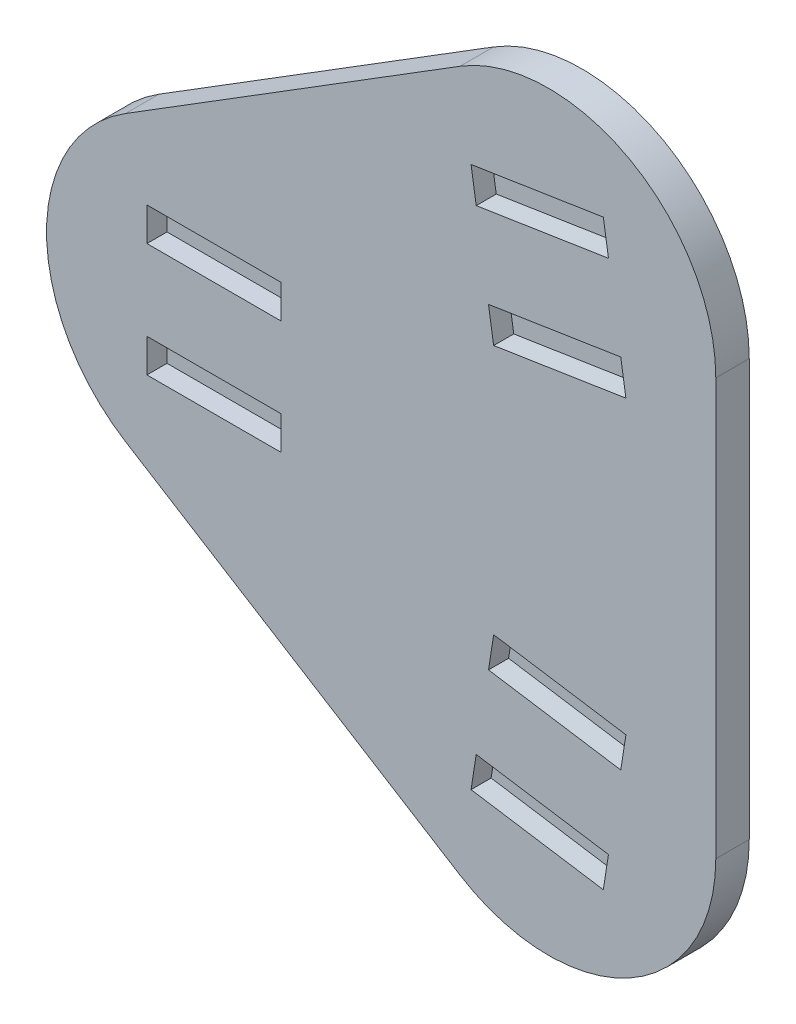
ISO-10303-21;
HEADER;
FILE_DESCRIPTION(('STEP AP214'),'2;1');
FILE_NAME('part.step','',(''),(''),'','','');
FILE_SCHEMA(('AUTOMOTIVE_DESIGN { 1 0 10303 214 1 1 1 1 }'));
ENDSEC;
DATA;
#1=APPLICATION_CONTEXT('core data for automotive mechanical design processes');
#2=APPLICATION_PROTOCOL_DEFINITION('international standard','automotive_design',2000,#1);
#3=PRODUCT_CONTEXT('',#1,'mechanical');
#4=PRODUCT('Part','Part','',(#3));
#5=PRODUCT_RELATED_PRODUCT_CATEGORY('part','',(#4));
#6=PRODUCT_DEFINITION_FORMATION('','',#4);
#7=PRODUCT_DEFINITION_CONTEXT('part definition',#1,'design');
#8=PRODUCT_DEFINITION('design','',#6,#7);
#9=PRODUCT_DEFINITION_SHAPE('','',#8);
#10=(LENGTH_UNIT() NAMED_UNIT(*) SI_UNIT(.MILLI.,.METRE.));
#11=(NAMED_UNIT(*) PLANE_ANGLE_UNIT() SI_UNIT($,.RADIAN.));
#12=(NAMED_UNIT(*) SI_UNIT($,.STERADIAN.) SOLID_ANGLE_UNIT());
#13=UNCERTAINTY_MEASURE_WITH_UNIT(LENGTH_MEASURE(1.E-05),#10,'distance_accuracy_value','');
#14=(GEOMETRIC_REPRESENTATION_CONTEXT(3) GLOBAL_UNCERTAINTY_ASSIGNED_CONTEXT((#13)) GLOBAL_UNIT_ASSIGNED_CONTEXT((#10,
#11,#12)) REPRESENTATION_CONTEXT('',''));
#15=CARTESIAN_POINT('',(0.,0.,0.));
#16=DIRECTION('',(0.,0.,1.));
#17=DIRECTION('',(1.,0.,0.));
#18=AXIS2_PLACEMENT_3D('',#15,#16,#17);
#19=CARTESIAN_POINT('',(0.,0.,3.));
#20=DIRECTION('',(0.,0.,1.));
#21=DIRECTION('',(1.,0.,0.));
#22=AXIS2_PLACEMENT_3D('',#19,#20,#21);
#23=PLANE('',#22);
#24=DIRECTION('',(-0.153498232012829,0.9881489223639,0.));
#25=VECTOR('',#24,1.);
#26=CARTESIAN_POINT('',(25.9604998315621,38.5786902593117,3.));
#27=LINE('',#26,#25);
#28=CARTESIAN_POINT('',(25.9604998315621,38.5786902593117,3.));
#29=VERTEX_POINT('',#28);
#30=CARTESIAN_POINT('',(25.1930086714979,43.5194348711312,3.));
#31=VERTEX_POINT('',#30);
#32=EDGE_CURVE('E288',#29,#31,#27,.T.);
#33=ORIENTED_EDGE('',*,*,#32,.F.);
#34=DIRECTION('',(0.9881489223639,0.153498232012826,0.));
#35=VECTOR('',#34,1.);
#36=CARTESIAN_POINT('',(6.19752138428396,35.5087256190551,3.));
#37=LINE('',#36,#35);
#38=CARTESIAN_POINT('',(6.19752138428396,35.5087256190551,3.));
#39=VERTEX_POINT('',#38);
#40=EDGE_CURVE('E285',#39,#29,#37,.T.);
#41=ORIENTED_EDGE('',*,*,#40,.F.);
#42=DIRECTION('',(0.153498232012828,-0.988148922363899,0.));
#43=VECTOR('',#42,1.);
#44=CARTESIAN_POINT('',(5.43003022421982,40.4494702308747,3.));
#45=LINE('',#44,#43);
#46=CARTESIAN_POINT('',(5.43003022421982,40.4494702308747,3.));
#47=VERTEX_POINT('',#46);
#48=EDGE_CURVE('E296',#47,#39,#45,.T.);
#49=ORIENTED_EDGE('',*,*,#48,.F.);
#50=DIRECTION('',(-0.9881489223639,-0.153498232012825,0.));
#51=VECTOR('',#50,1.);
#52=CARTESIAN_POINT('',(25.1930086714979,43.5194348711312,3.));
#53=LINE('',#52,#51);
#54=EDGE_CURVE('E292',#31,#47,#53,.T.);
#55=ORIENTED_EDGE('',*,*,#54,.F.);
#56=EDGE_LOOP('',(#33,#41,#49,#55));
#57=FACE_BOUND('',#56,.T.);
#58=DIRECTION('',(0.153498232012826,-0.9881489223639,0.));
#59=VECTOR('',#58,1.);
#60=CARTESIAN_POINT('',(8.03950016843787,23.6509385506883,3.));
#61=LINE('',#60,#59);
#62=CARTESIAN_POINT('',(8.03950016843787,23.6509385506883,3.));
#63=VERTEX_POINT('',#62);
#64=CARTESIAN_POINT('',(8.806991328502,18.7101939388688,3.));
#65=VERTEX_POINT('',#64);
#66=EDGE_CURVE('E330',#63,#65,#61,.T.);
#67=ORIENTED_EDGE('',*,*,#66,.F.);
#68=DIRECTION('',(-0.9881489223639,-0.153498232012827,0.));
#69=VECTOR('',#68,1.);
#70=CARTESIAN_POINT('',(27.802478615716,26.7209031909449,3.));
#71=LINE('',#70,#69);
#72=CARTESIAN_POINT('',(27.802478615716,26.7209031909449,3.));
#73=VERTEX_POINT('',#72);
#74=EDGE_CURVE('E327',#73,#63,#71,.T.);
#75=ORIENTED_EDGE('',*,*,#74,.F.);
#76=DIRECTION('',(-0.153498232012826,0.9881489223639,0.));
#77=VECTOR('',#76,1.);
#78=CARTESIAN_POINT('',(28.5699697757801,21.7801585791254,3.));
#79=LINE('',#78,#77);
#80=CARTESIAN_POINT('',(28.5699697757801,21.7801585791254,3.));
#81=VERTEX_POINT('',#80);
#82=EDGE_CURVE('E338',#81,#73,#79,.T.);
#83=ORIENTED_EDGE('',*,*,#82,.F.);
#84=DIRECTION('',(0.9881489223639,0.153498232012826,0.));
#85=VECTOR('',#84,1.);
#86=CARTESIAN_POINT('',(8.806991328502,18.7101939388688,3.));
#87=LINE('',#86,#85);
#88=EDGE_CURVE('E334',#65,#81,#87,.T.);
#89=ORIENTED_EDGE('',*,*,#88,.F.);
#90=EDGE_LOOP('',(#67,#75,#83,#89));
#91=FACE_BOUND('',#90,.T.);
#92=DIRECTION('',(0.,1.,0.));
#93=VECTOR('',#92,1.);
#94=CARTESIAN_POINT('',(-23.,6.,3.));
#95=LINE('',#94,#93);
#96=CARTESIAN_POINT('',(-23.,6.,3.));
#97=VERTEX_POINT('',#96);
#98=CARTESIAN_POINT('',(-23.,11.,3.));
#99=VERTEX_POINT('',#98);
#100=EDGE_CURVE('E372',#97,#99,#95,.T.);
#101=ORIENTED_EDGE('',*,*,#100,.F.);
#102=DIRECTION('',(1.,0.,0.));
#103=VECTOR('',#102,1.);
#104=CARTESIAN_POINT('',(-43.,6.,3.));
#105=LINE('',#104,#103);
#106=CARTESIAN_POINT('',(-43.,6.,3.));
#107=VERTEX_POINT('',#106);
#108=EDGE_CURVE('E369',#107,#97,#105,.T.);
#109=ORIENTED_EDGE('',*,*,#108,.F.);
#110=DIRECTION('',(0.,-1.,0.));
#111=VECTOR('',#110,1.);
#112=CARTESIAN_POINT('',(-43.,11.,3.));
#113=LINE('',#112,#111);
#114=CARTESIAN_POINT('',(-43.,11.,3.));
#115=VERTEX_POINT('',#114);
#116=EDGE_CURVE('E380',#115,#107,#113,.T.);
#117=ORIENTED_EDGE('',*,*,#116,.F.);
#118=DIRECTION('',(-1.,0.,0.));
#119=VECTOR('',#118,1.);
#120=CARTESIAN_POINT('',(-43.,11.,3.));
#121=LINE('',#120,#119);
#122=EDGE_CURVE('E376',#99,#115,#121,.T.);
#123=ORIENTED_EDGE('',*,*,#122,.F.);
#124=EDGE_LOOP('',(#101,#109,#117,#123));
#125=FACE_BOUND('',#124,.T.);
#126=DIRECTION('',(0.,1.,0.));
#127=VECTOR('',#126,1.);
#128=CARTESIAN_POINT('',(-23.,-11.,3.));
#129=LINE('',#128,#127);
#130=CARTESIAN_POINT('',(-23.,-11.,3.));
#131=VERTEX_POINT('',#130);
#132=CARTESIAN_POINT('',(-23.,-6.00000000000001,3.));
#133=VERTEX_POINT('',#132);
#134=EDGE_CURVE('E414',#131,#133,#129,.T.);
#135=ORIENTED_EDGE('',*,*,#134,.F.);
#136=DIRECTION('',(1.,0.,0.));
#137=VECTOR('',#136,1.);
#138=CARTESIAN_POINT('',(-43.,-11.,3.));
#139=LINE('',#138,#137);
#140=CARTESIAN_POINT('',(-43.,-11.,3.));
#141=VERTEX_POINT('',#140);
#142=EDGE_CURVE('E411',#141,#131,#139,.T.);
#143=ORIENTED_EDGE('',*,*,#142,.F.);
#144=DIRECTION('',(0.,-1.,0.));
#145=VECTOR('',#144,1.);
#146=CARTESIAN_POINT('',(-43.,-6.00000000000001,3.));
#147=LINE('',#146,#145);
#148=CARTESIAN_POINT('',(-43.,-6.00000000000001,3.));
#149=VERTEX_POINT('',#148);
#150=EDGE_CURVE('E422',#149,#141,#147,.T.);
#151=ORIENTED_EDGE('',*,*,#150,.F.);
#152=DIRECTION('',(-1.,0.,0.));
#153=VECTOR('',#152,1.);
#154=CARTESIAN_POINT('',(-43.,-6.00000000000001,3.));
#155=LINE('',#154,#153);
#156=EDGE_CURVE('E418',#133,#149,#155,.T.);
#157=ORIENTED_EDGE('',*,*,#156,.F.);
#158=EDGE_LOOP('',(#135,#143,#151,#157));
#159=FACE_BOUND('',#158,.T.);
#160=DIRECTION('',(-0.153498232012826,-0.9881489223639,0.));
#161=VECTOR('',#160,1.);
#162=CARTESIAN_POINT('',(8.80699132850207,-18.7101939388688,3.));
#163=LINE('',#162,#161);
#164=CARTESIAN_POINT('',(8.80699132850207,-18.7101939388688,3.));
#165=VERTEX_POINT('',#164);
#166=CARTESIAN_POINT('',(8.03950016843794,-23.6509385506883,3.));
#167=VERTEX_POINT('',#166);
#168=EDGE_CURVE('E456',#165,#167,#163,.T.);
#169=ORIENTED_EDGE('',*,*,#168,.F.);
#170=DIRECTION('',(-0.9881489223639,0.153498232012826,0.));
#171=VECTOR('',#170,1.);
#172=CARTESIAN_POINT('',(28.5699697757801,-21.7801585791254,3.));
#173=LINE('',#172,#171);
#174=CARTESIAN_POINT('',(28.5699697757801,-21.7801585791254,3.));
#175=VERTEX_POINT('',#174);
#176=EDGE_CURVE('E453',#175,#165,#173,.T.);
#177=ORIENTED_EDGE('',*,*,#176,.F.);
#178=DIRECTION('',(0.153498232012826,0.9881489223639,0.));
#179=VECTOR('',#178,1.);
#180=CARTESIAN_POINT('',(27.8024786157159,-26.7209031909449,3.));
#181=LINE('',#180,#179);
#182=CARTESIAN_POINT('',(27.8024786157159,-26.7209031909449,3.));
#183=VERTEX_POINT('',#182);
#184=EDGE_CURVE('E464',#183,#175,#181,.T.);
#185=ORIENTED_EDGE('',*,*,#184,.F.);
#186=DIRECTION('',(0.9881489223639,-0.153498232012826,0.));
#187=VECTOR('',#186,1.);
#188=CARTESIAN_POINT('',(8.03950016843794,-23.6509385506883,3.));
#189=LINE('',#188,#187);
#190=EDGE_CURVE('E460',#167,#183,#189,.T.);
#191=ORIENTED_EDGE('',*,*,#190,.F.);
#192=EDGE_LOOP('',(#169,#177,#185,#191));
#193=FACE_BOUND('',#192,.T.);
#194=DIRECTION('',(0.9881489223639,-0.153498232012826,0.));
#195=VECTOR('',#194,1.);
#196=CARTESIAN_POINT('',(5.43003022421989,-40.4494702308747,3.));
#197=LINE('',#196,#195);
#198=CARTESIAN_POINT('',(5.43003022421989,-40.4494702308747,3.));
#199=VERTEX_POINT('',#198);
#200=CARTESIAN_POINT('',(25.1930086714979,-43.5194348711312,3.));
#201=VERTEX_POINT('',#200);
#202=EDGE_CURVE('E503',#199,#201,#197,.T.);
#203=ORIENTED_EDGE('',*,*,#202,.F.);
#204=DIRECTION('',(-0.153498232012827,-0.9881489223639,0.));
#205=VECTOR('',#204,1.);
#206=CARTESIAN_POINT('',(6.19752138428403,-35.5087256190551,3.));
#207=LINE('',#206,#205);
#208=CARTESIAN_POINT('',(6.19752138428403,-35.5087256190551,3.));
#209=VERTEX_POINT('',#208);
#210=EDGE_CURVE('E499',#209,#199,#207,.T.);
#211=ORIENTED_EDGE('',*,*,#210,.F.);
#212=DIRECTION('',(-0.9881489223639,0.153498232012826,0.));
#213=VECTOR('',#212,1.);
#214=CARTESIAN_POINT('',(16.079010607923,-37.0437079391834,3.));
#215=LINE('',#214,#213);
#216=CARTESIAN_POINT('',(25.960499831562,-38.5786902593117,3.));
#217=VERTEX_POINT('',#216);
#218=EDGE_CURVE('E496',#217,#209,#215,.T.);
#219=ORIENTED_EDGE('',*,*,#218,.F.);
#220=DIRECTION('',(0.153498232012827,0.9881489223639,0.));
#221=VECTOR('',#220,1.);
#222=CARTESIAN_POINT('',(25.1930086714979,-43.5194348711312,3.));
#223=LINE('',#222,#221);
#224=EDGE_CURVE('E506',#201,#217,#223,.T.);
#225=ORIENTED_EDGE('',*,*,#224,.F.);
#226=EDGE_LOOP('',(#203,#211,#219,#225));
#227=FACE_BOUND('',#226,.T.);
#228=DIRECTION('',(0.849028395414197,-0.528347218957754,0.));
#229=VECTOR('',#228,1.);
#230=CARTESIAN_POINT('',(-46.2086804739439,-21.2257098853549,3.));
#231=LINE('',#230,#229);
#232=CARTESIAN_POINT('',(-46.2086804739439,-21.2257098853549,3.));
#233=VERTEX_POINT('',#232);
#234=CARTESIAN_POINT('',(3.79131952605611,-52.340524290355,3.));
#235=VERTEX_POINT('',#234);
#236=EDGE_CURVE('E269',#233,#235,#231,.T.);
#237=ORIENTED_EDGE('',*,*,#236,.T.);
#238=CARTESIAN_POINT('',(17.,-31.114814405,3.));
#239=DIRECTION('',(0.,0.,1.));
#240=DIRECTION('',(1.,0.,0.));
#241=AXIS2_PLACEMENT_3D('',#238,#239,#240);
#242=CIRCLE('',#241,25.);
#243=CARTESIAN_POINT('',(42.,-31.114814405,3.));
#244=VERTEX_POINT('',#243);
#245=EDGE_CURVE('E263',#235,#244,#242,.T.);
#246=ORIENTED_EDGE('',*,*,#245,.T.);
#247=DIRECTION('',(0.,1.,0.));
#248=VECTOR('',#247,1.);
#249=CARTESIAN_POINT('',(42.,-31.114814405,3.));
#250=LINE('',#249,#248);
#251=CARTESIAN_POINT('',(42.,31.114814405,3.));
#252=VERTEX_POINT('',#251);
#253=EDGE_CURVE('E259',#244,#252,#250,.T.);
#254=ORIENTED_EDGE('',*,*,#253,.T.);
#255=CARTESIAN_POINT('',(17.,31.114814405,3.));
#256=DIRECTION('',(0.,0.,1.));
#257=DIRECTION('',(1.,0.,0.));
#258=AXIS2_PLACEMENT_3D('',#255,#256,#257);
#259=CIRCLE('',#258,25.);
#260=CARTESIAN_POINT('',(3.7913195260561,52.3405242903549,3.));
#261=VERTEX_POINT('',#260);
#262=EDGE_CURVE('E54',#252,#261,#259,.T.);
#263=ORIENTED_EDGE('',*,*,#262,.T.);
#264=DIRECTION('',(-0.849028395414197,-0.528347218957755,0.));
#265=VECTOR('',#264,1.);
#266=CARTESIAN_POINT('',(-46.2086804739439,21.2257098853549,3.));
#267=LINE('',#266,#265);
#268=CARTESIAN_POINT('',(-46.2086804739439,21.2257098853549,3.));
#269=VERTEX_POINT('',#268);
#270=EDGE_CURVE('E247',#261,#269,#267,.T.);
#271=ORIENTED_EDGE('',*,*,#270,.T.);
#272=CARTESIAN_POINT('',(-33.,0.,3.));
#273=DIRECTION('',(0.,0.,1.));
#274=DIRECTION('',(1.,0.,0.));
#275=AXIS2_PLACEMENT_3D('',#272,#273,#274);
#276=CIRCLE('',#275,25.);
#277=EDGE_CURVE('E254',#269,#233,#276,.T.);
#278=ORIENTED_EDGE('',*,*,#277,.T.);
#279=EDGE_LOOP('',(#237,#246,#254,#263,#271,#278));
#280=FACE_BOUND('',#279,.T.);
#281=ADVANCED_FACE('F39',(#57,#91,#125,#159,#193,#227,#280),#23,.T.);
#282=CARTESIAN_POINT('',(6.19752138428403,-35.5087256190551,3.));
#283=DIRECTION('',(0.9881489223639,-0.153498232012827,0.));
#284=DIRECTION('',(0.153498232012827,0.9881489223639,0.));
#285=AXIS2_PLACEMENT_3D('',#282,#283,#284);
#286=PLANE('',#285);
#287=DIRECTION('',(-0.153498232012827,-0.9881489223639,0.));
#288=VECTOR('',#287,1.);
#289=CARTESIAN_POINT('',(6.19752138428403,-35.5087256190551,0.));
#290=LINE('',#289,#288);
#291=CARTESIAN_POINT('',(6.19752138428403,-35.5087256190551,0.));
#292=VERTEX_POINT('',#291);
#293=CARTESIAN_POINT('',(5.43003022421989,-40.4494702308747,0.));
#294=VERTEX_POINT('',#293);
#295=EDGE_CURVE('E495',#292,#294,#290,.T.);
#296=ORIENTED_EDGE('',*,*,#295,.F.);
#297=DIRECTION('',(0.,0.,-1.));
#298=VECTOR('',#297,1.);
#299=CARTESIAN_POINT('',(6.19752138428403,-35.5087256190551,3.));
#300=LINE('',#299,#298);
#301=EDGE_CURVE('E533',#209,#292,#300,.T.);
#302=ORIENTED_EDGE('',*,*,#301,.F.);
#303=ORIENTED_EDGE('',*,*,#210,.T.);
#304=DIRECTION('',(0.,0.,-1.));
#305=VECTOR('',#304,1.);
#306=CARTESIAN_POINT('',(5.43003022421989,-40.4494702308747,3.));
#307=LINE('',#306,#305);
#308=EDGE_CURVE('E530',#199,#294,#307,.T.);
#309=ORIENTED_EDGE('',*,*,#308,.T.);
#310=EDGE_LOOP('',(#296,#302,#303,#309));
#311=FACE_BOUND('',#310,.T.);
#312=ADVANCED_FACE('F573',(#311),#286,.T.);
#313=CARTESIAN_POINT('',(5.43003022421989,-40.4494702308747,3.));
#314=DIRECTION('',(0.153498232012826,0.9881489223639,0.));
#315=DIRECTION('',(-0.9881489223639,0.153498232012826,0.));
#316=AXIS2_PLACEMENT_3D('',#313,#314,#315);
#317=PLANE('',#316);
#318=DIRECTION('',(0.9881489223639,-0.153498232012826,0.));
#319=VECTOR('',#318,1.);
#320=CARTESIAN_POINT('',(5.43003022421989,-40.4494702308747,0.));
#321=LINE('',#320,#319);
#322=CARTESIAN_POINT('',(25.1930086714979,-43.5194348711312,0.));
#323=VERTEX_POINT('',#322);
#324=EDGE_CURVE('E514',#294,#323,#321,.T.);
#325=ORIENTED_EDGE('',*,*,#324,.F.);
#326=ORIENTED_EDGE('',*,*,#308,.F.);
#327=ORIENTED_EDGE('',*,*,#202,.T.);
#328=DIRECTION('',(0.,0.,-1.));
#329=VECTOR('',#328,1.);
#330=CARTESIAN_POINT('',(25.1930086714979,-43.5194348711312,3.));
#331=LINE('',#330,#329);
#332=EDGE_CURVE('E527',#201,#323,#331,.T.);
#333=ORIENTED_EDGE('',*,*,#332,.T.);
#334=EDGE_LOOP('',(#325,#326,#327,#333));
#335=FACE_BOUND('',#334,.T.);
#336=ADVANCED_FACE('F580',(#335),#317,.T.);
#337=CARTESIAN_POINT('',(25.1930086714979,-43.5194348711312,3.));
#338=DIRECTION('',(-0.9881489223639,0.153498232012827,0.));
#339=DIRECTION('',(-0.153498232012827,-0.9881489223639,0.));
#340=AXIS2_PLACEMENT_3D('',#337,#338,#339);
#341=PLANE('',#340);
#342=DIRECTION('',(0.153498232012827,0.9881489223639,0.));
#343=VECTOR('',#342,1.);
#344=CARTESIAN_POINT('',(25.1930086714979,-43.5194348711312,0.));
#345=LINE('',#344,#343);
#346=CARTESIAN_POINT('',(25.960499831562,-38.5786902593117,0.));
#347=VERTEX_POINT('',#346);
#348=EDGE_CURVE('E518',#323,#347,#345,.T.);
#349=ORIENTED_EDGE('',*,*,#348,.F.);
#350=ORIENTED_EDGE('',*,*,#332,.F.);
#351=ORIENTED_EDGE('',*,*,#224,.T.);
#352=DIRECTION('',(0.,0.,-1.));
#353=VECTOR('',#352,1.);
#354=CARTESIAN_POINT('',(25.960499831562,-38.5786902593117,3.));
#355=LINE('',#354,#353);
#356=EDGE_CURVE('E510',#217,#347,#355,.T.);
#357=ORIENTED_EDGE('',*,*,#356,.T.);
#358=EDGE_LOOP('',(#349,#350,#351,#357));
#359=FACE_BOUND('',#358,.T.);
#360=ADVANCED_FACE('F612',(#359),#341,.T.);
#361=CARTESIAN_POINT('',(25.960499831562,-38.5786902593117,3.));
#362=DIRECTION('',(-0.153498232012826,-0.9881489223639,0.));
#363=DIRECTION('',(0.9881489223639,-0.153498232012826,0.));
#364=AXIS2_PLACEMENT_3D('',#361,#362,#363);
#365=PLANE('',#364);
#366=DIRECTION('',(-0.9881489223639,0.153498232012826,0.));
#367=VECTOR('',#366,1.);
#368=CARTESIAN_POINT('',(25.960499831562,-38.5786902593117,0.));
#369=LINE('',#368,#367);
#370=EDGE_CURVE('E500',#347,#292,#369,.T.);
#371=ORIENTED_EDGE('',*,*,#370,.F.);
#372=ORIENTED_EDGE('',*,*,#356,.F.);
#373=ORIENTED_EDGE('',*,*,#218,.T.);
#374=ORIENTED_EDGE('',*,*,#301,.T.);
#375=EDGE_LOOP('',(#371,#372,#373,#374));
#376=FACE_BOUND('',#375,.T.);
#377=ADVANCED_FACE('F618',(#376),#365,.T.);
#378=CARTESIAN_POINT('',(28.5699697757801,-21.7801585791254,3.));
#379=DIRECTION('',(-0.153498232012826,-0.9881489223639,0.));
#380=DIRECTION('',(0.9881489223639,-0.153498232012826,0.));
#381=AXIS2_PLACEMENT_3D('',#378,#379,#380);
#382=PLANE('',#381);
#383=DIRECTION('',(-0.9881489223639,0.153498232012826,0.));
#384=VECTOR('',#383,1.);
#385=CARTESIAN_POINT('',(28.5699697757801,-21.7801585791254,0.));
#386=LINE('',#385,#384);
#387=CARTESIAN_POINT('',(28.5699697757801,-21.7801585791254,0.));
#388=VERTEX_POINT('',#387);
#389=CARTESIAN_POINT('',(8.80699132850207,-18.7101939388688,0.));
#390=VERTEX_POINT('',#389);
#391=EDGE_CURVE('E452',#388,#390,#386,.T.);
#392=ORIENTED_EDGE('',*,*,#391,.F.);
#393=DIRECTION('',(0.,0.,-1.));
#394=VECTOR('',#393,1.);
#395=CARTESIAN_POINT('',(28.5699697757801,-21.7801585791254,3.));
#396=LINE('',#395,#394);
#397=EDGE_CURVE('E467',#175,#388,#396,.T.);
#398=ORIENTED_EDGE('',*,*,#397,.F.);
#399=ORIENTED_EDGE('',*,*,#176,.T.);
#400=DIRECTION('',(0.,0.,-1.));
#401=VECTOR('',#400,1.);
#402=CARTESIAN_POINT('',(8.80699132850207,-18.7101939388688,3.));
#403=LINE('',#402,#401);
#404=EDGE_CURVE('E491',#165,#390,#403,.T.);
#405=ORIENTED_EDGE('',*,*,#404,.T.);
#406=EDGE_LOOP('',(#392,#398,#399,#405));
#407=FACE_BOUND('',#406,.T.);
#408=ADVANCED_FACE('F620',(#407),#382,.T.);
#409=CARTESIAN_POINT('',(8.80699132850207,-18.7101939388688,3.));
#410=DIRECTION('',(0.9881489223639,-0.153498232012826,0.));
#411=DIRECTION('',(0.153498232012826,0.9881489223639,0.));
#412=AXIS2_PLACEMENT_3D('',#409,#410,#411);
#413=PLANE('',#412);
#414=DIRECTION('',(-0.153498232012826,-0.9881489223639,0.));
#415=VECTOR('',#414,1.);
#416=CARTESIAN_POINT('',(8.80699132850207,-18.7101939388688,0.));
#417=LINE('',#416,#415);
#418=CARTESIAN_POINT('',(8.03950016843794,-23.6509385506883,0.));
#419=VERTEX_POINT('',#418);
#420=EDGE_CURVE('E471',#390,#419,#417,.T.);
#421=ORIENTED_EDGE('',*,*,#420,.F.);
#422=ORIENTED_EDGE('',*,*,#404,.F.);
#423=ORIENTED_EDGE('',*,*,#168,.T.);
#424=DIRECTION('',(0.,0.,-1.));
#425=VECTOR('',#424,1.);
#426=CARTESIAN_POINT('',(8.03950016843794,-23.6509385506883,3.));
#427=LINE('',#426,#425);
#428=EDGE_CURVE('E487',#167,#419,#427,.T.);
#429=ORIENTED_EDGE('',*,*,#428,.T.);
#430=EDGE_LOOP('',(#421,#422,#423,#429));
#431=FACE_BOUND('',#430,.T.);
#432=ADVANCED_FACE('F626',(#431),#413,.T.);
#433=CARTESIAN_POINT('',(17.9209893920769,-25.1859208708166,3.));
#434=DIRECTION('',(0.153498232012826,0.9881489223639,0.));
#435=DIRECTION('',(-0.9881489223639,0.153498232012826,0.));
#436=AXIS2_PLACEMENT_3D('',#433,#434,#435);
#437=PLANE('',#436);
#438=DIRECTION('',(0.9881489223639,-0.153498232012826,0.));
#439=VECTOR('',#438,1.);
#440=CARTESIAN_POINT('',(17.9209893920769,-25.1859208708166,0.));
#441=LINE('',#440,#439);
#442=CARTESIAN_POINT('',(27.8024786157159,-26.7209031909449,0.));
#443=VERTEX_POINT('',#442);
#444=EDGE_CURVE('E475',#419,#443,#441,.T.);
#445=ORIENTED_EDGE('',*,*,#444,.F.);
#446=ORIENTED_EDGE('',*,*,#428,.F.);
#447=ORIENTED_EDGE('',*,*,#190,.T.);
#448=DIRECTION('',(0.,0.,-1.));
#449=VECTOR('',#448,1.);
#450=CARTESIAN_POINT('',(27.8024786157159,-26.7209031909449,3.));
#451=LINE('',#450,#449);
#452=EDGE_CURVE('E484',#183,#443,#451,.T.);
#453=ORIENTED_EDGE('',*,*,#452,.T.);
#454=EDGE_LOOP('',(#445,#446,#447,#453));
#455=FACE_BOUND('',#454,.T.);
#456=ADVANCED_FACE('F661',(#455),#437,.T.);
#457=CARTESIAN_POINT('',(27.8024786157159,-26.7209031909449,3.));
#458=DIRECTION('',(-0.9881489223639,0.153498232012826,0.));
#459=DIRECTION('',(-0.153498232012826,-0.9881489223639,0.));
#460=AXIS2_PLACEMENT_3D('',#457,#458,#459);
#461=PLANE('',#460);
#462=DIRECTION('',(0.153498232012826,0.9881489223639,0.));
#463=VECTOR('',#462,1.);
#464=CARTESIAN_POINT('',(27.8024786157159,-26.7209031909449,0.));
#465=LINE('',#464,#463);
#466=EDGE_CURVE('E457',#443,#388,#465,.T.);
#467=ORIENTED_EDGE('',*,*,#466,.F.);
#468=ORIENTED_EDGE('',*,*,#452,.F.);
#469=ORIENTED_EDGE('',*,*,#184,.T.);
#470=ORIENTED_EDGE('',*,*,#397,.T.);
#471=EDGE_LOOP('',(#467,#468,#469,#470));
#472=FACE_BOUND('',#471,.T.);
#473=ADVANCED_FACE('F671',(#472),#461,.T.);
#474=CARTESIAN_POINT('',(-43.,-11.,3.));
#475=DIRECTION('',(0.,1.,0.));
#476=DIRECTION('',(0.,0.,1.));
#477=AXIS2_PLACEMENT_3D('',#474,#475,#476);
#478=PLANE('',#477);
#479=DIRECTION('',(1.,0.,0.));
#480=VECTOR('',#479,1.);
#481=CARTESIAN_POINT('',(-43.,-11.,0.));
#482=LINE('',#481,#480);
#483=CARTESIAN_POINT('',(-43.,-11.,0.));
#484=VERTEX_POINT('',#483);
#485=CARTESIAN_POINT('',(-23.,-11.,0.));
#486=VERTEX_POINT('',#485);
#487=EDGE_CURVE('E410',#484,#486,#482,.T.);
#488=ORIENTED_EDGE('',*,*,#487,.F.);
#489=DIRECTION('',(0.,0.,-1.));
#490=VECTOR('',#489,1.);
#491=CARTESIAN_POINT('',(-43.,-11.,3.));
#492=LINE('',#491,#490);
#493=EDGE_CURVE('E425',#141,#484,#492,.T.);
#494=ORIENTED_EDGE('',*,*,#493,.F.);
#495=ORIENTED_EDGE('',*,*,#142,.T.);
#496=DIRECTION('',(0.,0.,-1.));
#497=VECTOR('',#496,1.);
#498=CARTESIAN_POINT('',(-23.,-11.,3.));
#499=LINE('',#498,#497);
#500=EDGE_CURVE('E448',#131,#486,#499,.T.);
#501=ORIENTED_EDGE('',*,*,#500,.T.);
#502=EDGE_LOOP('',(#488,#494,#495,#501));
#503=FACE_BOUND('',#502,.T.);
#504=ADVANCED_FACE('F681',(#503),#478,.T.);
#505=CARTESIAN_POINT('',(-23.,-11.,3.));
#506=DIRECTION('',(-1.,0.,0.));
#507=DIRECTION('',(0.,0.,1.));
#508=AXIS2_PLACEMENT_3D('',#505,#506,#507);
#509=PLANE('',#508);
#510=DIRECTION('',(0.,1.,0.));
#511=VECTOR('',#510,1.);
#512=CARTESIAN_POINT('',(-23.,-11.,0.));
#513=LINE('',#512,#511);
#514=CARTESIAN_POINT('',(-23.,-6.00000000000001,0.));
#515=VERTEX_POINT('',#514);
#516=EDGE_CURVE('E429',#486,#515,#513,.T.);
#517=ORIENTED_EDGE('',*,*,#516,.F.);
#518=ORIENTED_EDGE('',*,*,#500,.F.);
#519=ORIENTED_EDGE('',*,*,#134,.T.);
#520=DIRECTION('',(0.,0.,-1.));
#521=VECTOR('',#520,1.);
#522=CARTESIAN_POINT('',(-23.,-6.00000000000001,3.));
#523=LINE('',#522,#521);
#524=EDGE_CURVE('E445',#133,#515,#523,.T.);
#525=ORIENTED_EDGE('',*,*,#524,.T.);
#526=EDGE_LOOP('',(#517,#518,#519,#525));
#527=FACE_BOUND('',#526,.T.);
#528=ADVANCED_FACE('F691',(#527),#509,.T.);
#529=CARTESIAN_POINT('',(-43.,-6.00000000000001,3.));
#530=DIRECTION('',(0.,-1.,0.));
#531=DIRECTION('',(0.,0.,-1.));
#532=AXIS2_PLACEMENT_3D('',#529,#530,#531);
#533=PLANE('',#532);
#534=DIRECTION('',(-1.,0.,0.));
#535=VECTOR('',#534,1.);
#536=CARTESIAN_POINT('',(-43.,-6.00000000000001,0.));
#537=LINE('',#536,#535);
#538=CARTESIAN_POINT('',(-43.,-6.00000000000001,0.));
#539=VERTEX_POINT('',#538);
#540=EDGE_CURVE('E433',#515,#539,#537,.T.);
#541=ORIENTED_EDGE('',*,*,#540,.F.);
#542=ORIENTED_EDGE('',*,*,#524,.F.);
#543=ORIENTED_EDGE('',*,*,#156,.T.);
#544=DIRECTION('',(0.,0.,-1.));
#545=VECTOR('',#544,1.);
#546=CARTESIAN_POINT('',(-43.,-6.00000000000001,3.));
#547=LINE('',#546,#545);
#548=EDGE_CURVE('E442',#149,#539,#547,.T.);
#549=ORIENTED_EDGE('',*,*,#548,.T.);
#550=EDGE_LOOP('',(#541,#542,#543,#549));
#551=FACE_BOUND('',#550,.T.);
#552=ADVANCED_FACE('F701',(#551),#533,.T.);
#553=CARTESIAN_POINT('',(-43.,-6.00000000000001,3.));
#554=DIRECTION('',(1.,0.,0.));
#555=DIRECTION('',(0.,0.,-1.));
#556=AXIS2_PLACEMENT_3D('',#553,#554,#555);
#557=PLANE('',#556);
#558=DIRECTION('',(0.,-1.,0.));
#559=VECTOR('',#558,1.);
#560=CARTESIAN_POINT('',(-43.,-6.00000000000001,0.));
#561=LINE('',#560,#559);
#562=EDGE_CURVE('E415',#539,#484,#561,.T.);
#563=ORIENTED_EDGE('',*,*,#562,.F.);
#564=ORIENTED_EDGE('',*,*,#548,.F.);
#565=ORIENTED_EDGE('',*,*,#150,.T.);
#566=ORIENTED_EDGE('',*,*,#493,.T.);
#567=EDGE_LOOP('',(#563,#564,#565,#566));
#568=FACE_BOUND('',#567,.T.);
#569=ADVANCED_FACE('F711',(#568),#557,.T.);
#570=CARTESIAN_POINT('',(-43.,6.,3.));
#571=DIRECTION('',(0.,1.,0.));
#572=DIRECTION('',(0.,0.,1.));
#573=AXIS2_PLACEMENT_3D('',#570,#571,#572);
#574=PLANE('',#573);
#575=DIRECTION('',(1.,0.,0.));
#576=VECTOR('',#575,1.);
#577=CARTESIAN_POINT('',(-43.,6.,0.));
#578=LINE('',#577,#576);
#579=CARTESIAN_POINT('',(-43.,6.,0.));
#580=VERTEX_POINT('',#579);
#581=CARTESIAN_POINT('',(-23.,6.,0.));
#582=VERTEX_POINT('',#581);
#583=EDGE_CURVE('E368',#580,#582,#578,.T.);
#584=ORIENTED_EDGE('',*,*,#583,.F.);
#585=DIRECTION('',(0.,0.,-1.));
#586=VECTOR('',#585,1.);
#587=CARTESIAN_POINT('',(-43.,6.,3.));
#588=LINE('',#587,#586);
#589=EDGE_CURVE('E383',#107,#580,#588,.T.);
#590=ORIENTED_EDGE('',*,*,#589,.F.);
#591=ORIENTED_EDGE('',*,*,#108,.T.);
#592=DIRECTION('',(0.,0.,-1.));
#593=VECTOR('',#592,1.);
#594=CARTESIAN_POINT('',(-23.,6.,3.));
#595=LINE('',#594,#593);
#596=EDGE_CURVE('E406',#97,#582,#595,.T.);
#597=ORIENTED_EDGE('',*,*,#596,.T.);
#598=EDGE_LOOP('',(#584,#590,#591,#597));
#599=FACE_BOUND('',#598,.T.);
#600=ADVANCED_FACE('F721',(#599),#574,.T.);
#601=CARTESIAN_POINT('',(-23.,6.,3.));
#602=DIRECTION('',(-1.,0.,0.));
#603=DIRECTION('',(0.,0.,1.));
#604=AXIS2_PLACEMENT_3D('',#601,#602,#603);
#605=PLANE('',#604);
#606=DIRECTION('',(0.,1.,0.));
#607=VECTOR('',#606,1.);
#608=CARTESIAN_POINT('',(-23.,6.,0.));
#609=LINE('',#608,#607);
#610=CARTESIAN_POINT('',(-23.,11.,0.));
#611=VERTEX_POINT('',#610);
#612=EDGE_CURVE('E387',#582,#611,#609,.T.);
#613=ORIENTED_EDGE('',*,*,#612,.F.);
#614=ORIENTED_EDGE('',*,*,#596,.F.);
#615=ORIENTED_EDGE('',*,*,#100,.T.);
#616=DIRECTION('',(0.,0.,-1.));
#617=VECTOR('',#616,1.);
#618=CARTESIAN_POINT('',(-23.,11.,3.));
#619=LINE('',#618,#617);
#620=EDGE_CURVE('E403',#99,#611,#619,.T.);
#621=ORIENTED_EDGE('',*,*,#620,.T.);
#622=EDGE_LOOP('',(#613,#614,#615,#621));
#623=FACE_BOUND('',#622,.T.);
#624=ADVANCED_FACE('F731',(#623),#605,.T.);
#625=CARTESIAN_POINT('',(-43.,11.,3.));
#626=DIRECTION('',(0.,-1.,0.));
#627=DIRECTION('',(0.,0.,-1.));
#628=AXIS2_PLACEMENT_3D('',#625,#626,#627);
#629=PLANE('',#628);
#630=DIRECTION('',(-1.,0.,0.));
#631=VECTOR('',#630,1.);
#632=CARTESIAN_POINT('',(-43.,11.,0.));
#633=LINE('',#632,#631);
#634=CARTESIAN_POINT('',(-43.,11.,0.));
#635=VERTEX_POINT('',#634);
#636=EDGE_CURVE('E391',#611,#635,#633,.T.);
#637=ORIENTED_EDGE('',*,*,#636,.F.);
#638=ORIENTED_EDGE('',*,*,#620,.F.);
#639=ORIENTED_EDGE('',*,*,#122,.T.);
#640=DIRECTION('',(0.,0.,-1.));
#641=VECTOR('',#640,1.);
#642=CARTESIAN_POINT('',(-43.,11.,3.));
#643=LINE('',#642,#641);
#644=EDGE_CURVE('E400',#115,#635,#643,.T.);
#645=ORIENTED_EDGE('',*,*,#644,.T.);
#646=EDGE_LOOP('',(#637,#638,#639,#645));
#647=FACE_BOUND('',#646,.T.);
#648=ADVANCED_FACE('F741',(#647),#629,.T.);
#649=CARTESIAN_POINT('',(-43.,11.,3.));
#650=DIRECTION('',(1.,0.,0.));
#651=DIRECTION('',(0.,0.,-1.));
#652=AXIS2_PLACEMENT_3D('',#649,#650,#651);
#653=PLANE('',#652);
#654=DIRECTION('',(0.,-1.,0.));
#655=VECTOR('',#654,1.);
#656=CARTESIAN_POINT('',(-43.,11.,0.));
#657=LINE('',#656,#655);
#658=EDGE_CURVE('E373',#635,#580,#657,.T.);
#659=ORIENTED_EDGE('',*,*,#658,.F.);
#660=ORIENTED_EDGE('',*,*,#644,.F.);
#661=ORIENTED_EDGE('',*,*,#116,.T.);
#662=ORIENTED_EDGE('',*,*,#589,.T.);
#663=EDGE_LOOP('',(#659,#660,#661,#662));
#664=FACE_BOUND('',#663,.T.);
#665=ADVANCED_FACE('F751',(#664),#653,.T.);
#666=CARTESIAN_POINT('',(17.9209893920769,25.1859208708166,3.));
#667=DIRECTION('',(0.153498232012826,-0.9881489223639,0.));
#668=DIRECTION('',(0.9881489223639,0.153498232012826,0.));
#669=AXIS2_PLACEMENT_3D('',#666,#667,#668);
#670=PLANE('',#669);
#671=DIRECTION('',(-0.9881489223639,-0.153498232012826,0.));
#672=VECTOR('',#671,1.);
#673=CARTESIAN_POINT('',(17.9209893920769,25.1859208708166,0.));
#674=LINE('',#673,#672);
#675=CARTESIAN_POINT('',(27.802478615716,26.7209031909449,0.));
#676=VERTEX_POINT('',#675);
#677=CARTESIAN_POINT('',(8.03950016843787,23.6509385506883,0.));
#678=VERTEX_POINT('',#677);
#679=EDGE_CURVE('E326',#676,#678,#674,.T.);
#680=ORIENTED_EDGE('',*,*,#679,.F.);
#681=DIRECTION('',(0.,0.,-1.));
#682=VECTOR('',#681,1.);
#683=CARTESIAN_POINT('',(27.802478615716,26.7209031909449,3.));
#684=LINE('',#683,#682);
#685=EDGE_CURVE('E341',#73,#676,#684,.T.);
#686=ORIENTED_EDGE('',*,*,#685,.F.);
#687=ORIENTED_EDGE('',*,*,#74,.T.);
#688=DIRECTION('',(0.,0.,-1.));
#689=VECTOR('',#688,1.);
#690=CARTESIAN_POINT('',(8.03950016843787,23.6509385506883,3.));
#691=LINE('',#690,#689);
#692=EDGE_CURVE('E365',#63,#678,#691,.T.);
#693=ORIENTED_EDGE('',*,*,#692,.T.);
#694=EDGE_LOOP('',(#680,#686,#687,#693));
#695=FACE_BOUND('',#694,.T.);
#696=ADVANCED_FACE('F761',(#695),#670,.T.);
#697=CARTESIAN_POINT('',(8.03950016843787,23.6509385506883,3.));
#698=DIRECTION('',(0.9881489223639,0.153498232012826,0.));
#699=DIRECTION('',(-0.153498232012826,0.9881489223639,0.));
#700=AXIS2_PLACEMENT_3D('',#697,#698,#699);
#701=PLANE('',#700);
#702=DIRECTION('',(0.153498232012826,-0.9881489223639,0.));
#703=VECTOR('',#702,1.);
#704=CARTESIAN_POINT('',(8.03950016843787,23.6509385506883,0.));
#705=LINE('',#704,#703);
#706=CARTESIAN_POINT('',(8.806991328502,18.7101939388688,0.));
#707=VERTEX_POINT('',#706);
#708=EDGE_CURVE('E345',#678,#707,#705,.T.);
#709=ORIENTED_EDGE('',*,*,#708,.F.);
#710=ORIENTED_EDGE('',*,*,#692,.F.);
#711=ORIENTED_EDGE('',*,*,#66,.T.);
#712=DIRECTION('',(0.,0.,-1.));
#713=VECTOR('',#712,1.);
#714=CARTESIAN_POINT('',(8.806991328502,18.7101939388688,3.));
#715=LINE('',#714,#713);
#716=EDGE_CURVE('E362',#65,#707,#715,.T.);
#717=ORIENTED_EDGE('',*,*,#716,.T.);
#718=EDGE_LOOP('',(#709,#710,#711,#717));
#719=FACE_BOUND('',#718,.T.);
#720=ADVANCED_FACE('F772',(#719),#701,.T.);
#721=CARTESIAN_POINT('',(8.806991328502,18.7101939388688,3.));
#722=DIRECTION('',(-0.153498232012826,0.9881489223639,0.));
#723=DIRECTION('',(-0.9881489223639,-0.153498232012826,0.));
#724=AXIS2_PLACEMENT_3D('',#721,#722,#723);
#725=PLANE('',#724);
#726=DIRECTION('',(0.9881489223639,0.153498232012826,0.));
#727=VECTOR('',#726,1.);
#728=CARTESIAN_POINT('',(8.806991328502,18.7101939388688,0.));
#729=LINE('',#728,#727);
#730=CARTESIAN_POINT('',(28.5699697757801,21.7801585791254,0.));
#731=VERTEX_POINT('',#730);
#732=EDGE_CURVE('E349',#707,#731,#729,.T.);
#733=ORIENTED_EDGE('',*,*,#732,.F.);
#734=ORIENTED_EDGE('',*,*,#716,.F.);
#735=ORIENTED_EDGE('',*,*,#88,.T.);
#736=DIRECTION('',(0.,0.,-1.));
#737=VECTOR('',#736,1.);
#738=CARTESIAN_POINT('',(28.5699697757801,21.7801585791254,3.));
#739=LINE('',#738,#737);
#740=EDGE_CURVE('E359',#81,#731,#739,.T.);
#741=ORIENTED_EDGE('',*,*,#740,.T.);
#742=EDGE_LOOP('',(#733,#734,#735,#741));
#743=FACE_BOUND('',#742,.T.);
#744=ADVANCED_FACE('F782',(#743),#725,.T.);
#745=CARTESIAN_POINT('',(28.5699697757801,21.7801585791254,3.));
#746=DIRECTION('',(-0.9881489223639,-0.153498232012826,0.));
#747=DIRECTION('',(0.153498232012826,-0.9881489223639,0.));
#748=AXIS2_PLACEMENT_3D('',#745,#746,#747);
#749=PLANE('',#748);
#750=DIRECTION('',(-0.153498232012826,0.9881489223639,0.));
#751=VECTOR('',#750,1.);
#752=CARTESIAN_POINT('',(28.5699697757801,21.7801585791254,0.));
#753=LINE('',#752,#751);
#754=EDGE_CURVE('E331',#731,#676,#753,.T.);
#755=ORIENTED_EDGE('',*,*,#754,.F.);
#756=ORIENTED_EDGE('',*,*,#740,.F.);
#757=ORIENTED_EDGE('',*,*,#82,.T.);
#758=ORIENTED_EDGE('',*,*,#685,.T.);
#759=EDGE_LOOP('',(#755,#756,#757,#758));
#760=FACE_BOUND('',#759,.T.);
#761=ADVANCED_FACE('F792',(#760),#749,.T.);
#762=CARTESIAN_POINT('',(16.079010607923,37.0437079391834,3.));
#763=DIRECTION('',(-0.153498232012826,0.9881489223639,0.));
#764=DIRECTION('',(-0.9881489223639,-0.153498232012826,0.));
#765=AXIS2_PLACEMENT_3D('',#762,#763,#764);
#766=PLANE('',#765);
#767=DIRECTION('',(0.9881489223639,0.153498232012826,0.));
#768=VECTOR('',#767,1.);
#769=CARTESIAN_POINT('',(16.079010607923,37.0437079391834,0.));
#770=LINE('',#769,#768);
#771=CARTESIAN_POINT('',(6.19752138428396,35.5087256190551,0.));
#772=VERTEX_POINT('',#771);
#773=CARTESIAN_POINT('',(25.9604998315621,38.5786902593117,0.));
#774=VERTEX_POINT('',#773);
#775=EDGE_CURVE('E275',#772,#774,#770,.T.);
#776=ORIENTED_EDGE('',*,*,#775,.F.);
#777=DIRECTION('',(0.,0.,-1.));
#778=VECTOR('',#777,1.);
#779=CARTESIAN_POINT('',(6.19752138428396,35.5087256190551,3.));
#780=LINE('',#779,#778);
#781=EDGE_CURVE('E299',#39,#772,#780,.T.);
#782=ORIENTED_EDGE('',*,*,#781,.F.);
#783=ORIENTED_EDGE('',*,*,#40,.T.);
#784=DIRECTION('',(0.,0.,-1.));
#785=VECTOR('',#784,1.);
#786=CARTESIAN_POINT('',(25.9604998315621,38.5786902593117,3.));
#787=LINE('',#786,#785);
#788=EDGE_CURVE('E323',#29,#774,#787,.T.);
#789=ORIENTED_EDGE('',*,*,#788,.T.);
#790=EDGE_LOOP('',(#776,#782,#783,#789));
#791=FACE_BOUND('',#790,.T.);
#792=ADVANCED_FACE('F802',(#791),#766,.T.);
#793=CARTESIAN_POINT('',(25.9604998315621,38.5786902593117,3.));
#794=DIRECTION('',(-0.9881489223639,-0.153498232012829,0.));
#795=DIRECTION('',(0.153498232012829,-0.9881489223639,0.));
#796=AXIS2_PLACEMENT_3D('',#793,#794,#795);
#797=PLANE('',#796);
#798=DIRECTION('',(-0.153498232012829,0.9881489223639,0.));
#799=VECTOR('',#798,1.);
#800=CARTESIAN_POINT('',(25.9604998315621,38.5786902593117,0.));
#801=LINE('',#800,#799);
#802=CARTESIAN_POINT('',(25.1930086714979,43.5194348711312,0.));
#803=VERTEX_POINT('',#802);
#804=EDGE_CURVE('E303',#774,#803,#801,.T.);
#805=ORIENTED_EDGE('',*,*,#804,.F.);
#806=ORIENTED_EDGE('',*,*,#788,.F.);
#807=ORIENTED_EDGE('',*,*,#32,.T.);
#808=DIRECTION('',(0.,0.,-1.));
#809=VECTOR('',#808,1.);
#810=CARTESIAN_POINT('',(25.1930086714979,43.5194348711312,3.));
#811=LINE('',#810,#809);
#812=EDGE_CURVE('E320',#31,#803,#811,.T.);
#813=ORIENTED_EDGE('',*,*,#812,.T.);
#814=EDGE_LOOP('',(#805,#806,#807,#813));
#815=FACE_BOUND('',#814,.T.);
#816=ADVANCED_FACE('F813',(#815),#797,.T.);
#817=CARTESIAN_POINT('',(25.1930086714979,43.5194348711312,3.));
#818=DIRECTION('',(0.153498232012825,-0.9881489223639,0.));
#819=DIRECTION('',(0.9881489223639,0.153498232012825,0.));
#820=AXIS2_PLACEMENT_3D('',#817,#818,#819);
#821=PLANE('',#820);
#822=DIRECTION('',(-0.9881489223639,-0.153498232012825,0.));
#823=VECTOR('',#822,1.);
#824=CARTESIAN_POINT('',(25.1930086714979,43.5194348711312,0.));
#825=LINE('',#824,#823);
#826=CARTESIAN_POINT('',(5.43003022421982,40.4494702308747,0.));
#827=VERTEX_POINT('',#826);
#828=EDGE_CURVE('E307',#803,#827,#825,.T.);
#829=ORIENTED_EDGE('',*,*,#828,.F.);
#830=ORIENTED_EDGE('',*,*,#812,.F.);
#831=ORIENTED_EDGE('',*,*,#54,.T.);
#832=DIRECTION('',(0.,0.,-1.));
#833=VECTOR('',#832,1.);
#834=CARTESIAN_POINT('',(5.43003022421982,40.4494702308747,3.));
#835=LINE('',#834,#833);
#836=EDGE_CURVE('E317',#47,#827,#835,.T.);
#837=ORIENTED_EDGE('',*,*,#836,.T.);
#838=EDGE_LOOP('',(#829,#830,#831,#837));
#839=FACE_BOUND('',#838,.T.);
#840=ADVANCED_FACE('F823',(#839),#821,.T.);
#841=CARTESIAN_POINT('',(5.43003022421982,40.4494702308747,3.));
#842=DIRECTION('',(0.9881489223639,0.153498232012828,0.));
#843=DIRECTION('',(-0.153498232012828,0.9881489223639,0.));
#844=AXIS2_PLACEMENT_3D('',#841,#842,#843);
#845=PLANE('',#844);
#846=DIRECTION('',(0.153498232012828,-0.988148922363899,0.));
#847=VECTOR('',#846,1.);
#848=CARTESIAN_POINT('',(5.43003022421982,40.4494702308747,0.));
#849=LINE('',#848,#847);
#850=EDGE_CURVE('E289',#827,#772,#849,.T.);
#851=ORIENTED_EDGE('',*,*,#850,.F.);
#852=ORIENTED_EDGE('',*,*,#836,.F.);
#853=ORIENTED_EDGE('',*,*,#48,.T.);
#854=ORIENTED_EDGE('',*,*,#781,.T.);
#855=EDGE_LOOP('',(#851,#852,#853,#854));
#856=FACE_BOUND('',#855,.T.);
#857=ADVANCED_FACE('F833',(#856),#845,.T.);
#858=CARTESIAN_POINT('',(0.,0.,0.));
#859=DIRECTION('',(0.,0.,-1.));
#860=DIRECTION('',(-1.,0.,0.));
#861=AXIS2_PLACEMENT_3D('',#858,#859,#860);
#862=PLANE('',#861);
#863=ORIENTED_EDGE('',*,*,#850,.T.);
#864=ORIENTED_EDGE('',*,*,#775,.T.);
#865=ORIENTED_EDGE('',*,*,#804,.T.);
#866=ORIENTED_EDGE('',*,*,#828,.T.);
#867=EDGE_LOOP('',(#863,#864,#865,#866));
#868=FACE_BOUND('',#867,.T.);
#869=ADVANCED_FACE('F843',(#868),#862,.F.);
#870=ORIENTED_EDGE('',*,*,#658,.T.);
#871=ORIENTED_EDGE('',*,*,#583,.T.);
#872=ORIENTED_EDGE('',*,*,#612,.T.);
#873=ORIENTED_EDGE('',*,*,#636,.T.);
#874=EDGE_LOOP('',(#870,#871,#872,#873));
#875=FACE_BOUND('',#874,.T.);
#876=ADVANCED_FACE('F853',(#875),#862,.F.);
#877=ORIENTED_EDGE('',*,*,#466,.T.);
#878=ORIENTED_EDGE('',*,*,#391,.T.);
#879=ORIENTED_EDGE('',*,*,#420,.T.);
#880=ORIENTED_EDGE('',*,*,#444,.T.);
#881=EDGE_LOOP('',(#877,#878,#879,#880));
#882=FACE_BOUND('',#881,.T.);
#883=ADVANCED_FACE('F864',(#882),#862,.F.);
#884=ORIENTED_EDGE('',*,*,#370,.T.);
#885=ORIENTED_EDGE('',*,*,#295,.T.);
#886=ORIENTED_EDGE('',*,*,#324,.T.);
#887=ORIENTED_EDGE('',*,*,#348,.T.);
#888=EDGE_LOOP('',(#884,#885,#886,#887));
#889=FACE_BOUND('',#888,.T.);
#890=ADVANCED_FACE('F615',(#889),#862,.F.);
#891=ORIENTED_EDGE('',*,*,#562,.T.);
#892=ORIENTED_EDGE('',*,*,#487,.T.);
#893=ORIENTED_EDGE('',*,*,#516,.T.);
#894=ORIENTED_EDGE('',*,*,#540,.T.);
#895=EDGE_LOOP('',(#891,#892,#893,#894));
#896=FACE_BOUND('',#895,.T.);
#897=ADVANCED_FACE('F881',(#896),#862,.F.);
#898=ORIENTED_EDGE('',*,*,#754,.T.);
#899=ORIENTED_EDGE('',*,*,#679,.T.);
#900=ORIENTED_EDGE('',*,*,#708,.T.);
#901=ORIENTED_EDGE('',*,*,#732,.T.);
#902=EDGE_LOOP('',(#898,#899,#900,#901));
#903=FACE_BOUND('',#902,.T.);
#904=ADVANCED_FACE('F856',(#903),#862,.F.);
#905=CARTESIAN_POINT('',(17.,-31.114814405,-7.));
#906=DIRECTION('',(0.,0.,1.));
#907=DIRECTION('',(1.,0.,0.));
#908=AXIS2_PLACEMENT_3D('',#905,#906,#907);
#909=CYLINDRICAL_SURFACE('',#908,25.);
#910=DIRECTION('',(0.,0.,1.));
#911=VECTOR('',#910,1.);
#912=CARTESIAN_POINT('',(42.,-31.114814405,-7.));
#913=LINE('',#912,#911);
#914=CARTESIAN_POINT('',(42.,-31.114814405,-2.));
#915=VERTEX_POINT('',#914);
#916=EDGE_CURVE('E62',#915,#244,#913,.T.);
#917=ORIENTED_EDGE('',*,*,#916,.T.);
#918=ORIENTED_EDGE('',*,*,#245,.F.);
#919=DIRECTION('',(0.,0.,1.));
#920=VECTOR('',#919,1.);
#921=CARTESIAN_POINT('',(3.79131952605611,-52.340524290355,-7.));
#922=LINE('',#921,#920);
#923=CARTESIAN_POINT('',(3.79131952605611,-52.340524290355,-2.));
#924=VERTEX_POINT('',#923);
#925=EDGE_CURVE('E272',#924,#235,#922,.T.);
#926=ORIENTED_EDGE('',*,*,#925,.F.);
#927=CARTESIAN_POINT('',(17.,-31.114814405,-2.));
#928=DIRECTION('',(0.,0.,-1.));
#929=DIRECTION('',(-1.,0.,0.));
#930=AXIS2_PLACEMENT_3D('',#927,#928,#929);
#931=CIRCLE('',#930,25.);
#932=EDGE_CURVE('E12',#915,#924,#931,.T.);
#933=ORIENTED_EDGE('',*,*,#932,.F.);
#934=EDGE_LOOP('',(#917,#918,#926,#933));
#935=FACE_BOUND('',#934,.T.);
#936=ADVANCED_FACE('F560',(#935),#909,.T.);
#937=CARTESIAN_POINT('',(-46.2086804739439,-21.2257098853549,-7.));
#938=DIRECTION('',(-0.528347218957754,-0.849028395414197,0.));
#939=DIRECTION('',(0.849028395414198,-0.528347218957755,0.));
#940=AXIS2_PLACEMENT_3D('',#937,#938,#939);
#941=PLANE('',#940);
#942=ORIENTED_EDGE('',*,*,#925,.T.);
#943=ORIENTED_EDGE('',*,*,#236,.F.);
#944=DIRECTION('',(0.,0.,1.));
#945=VECTOR('',#944,1.);
#946=CARTESIAN_POINT('',(-46.2086804739439,-21.2257098853549,-7.));
#947=LINE('',#946,#945);
#948=CARTESIAN_POINT('',(-46.2086804739439,-21.2257098853549,-2.));
#949=VERTEX_POINT('',#948);
#950=EDGE_CURVE('E276',#949,#233,#947,.T.);
#951=ORIENTED_EDGE('',*,*,#950,.F.);
#952=DIRECTION('',(-0.849028395414198,0.528347218957755,0.));
#953=VECTOR('',#952,1.);
#954=CARTESIAN_POINT('',(-22.4206563386969,-36.0289090059524,-2.));
#955=LINE('',#954,#953);
#956=EDGE_CURVE('E47',#924,#949,#955,.T.);
#957=ORIENTED_EDGE('',*,*,#956,.F.);
#958=EDGE_LOOP('',(#942,#943,#951,#957));
#959=FACE_BOUND('',#958,.T.);
#960=ADVANCED_FACE('F556',(#959),#941,.T.);
#961=CARTESIAN_POINT('',(-33.,0.,-7.));
#962=DIRECTION('',(0.,0.,1.));
#963=DIRECTION('',(1.,0.,0.));
#964=AXIS2_PLACEMENT_3D('',#961,#962,#963);
#965=CYLINDRICAL_SURFACE('',#964,25.);
#966=ORIENTED_EDGE('',*,*,#950,.T.);
#967=ORIENTED_EDGE('',*,*,#277,.F.);
#968=DIRECTION('',(0.,0.,1.));
#969=VECTOR('',#968,1.);
#970=CARTESIAN_POINT('',(-46.2086804739439,21.2257098853549,-7.));
#971=LINE('',#970,#969);
#972=CARTESIAN_POINT('',(-46.2086804739439,21.2257098853549,-2.));
#973=VERTEX_POINT('',#972);
#974=EDGE_CURVE('E243',#973,#269,#971,.T.);
#975=ORIENTED_EDGE('',*,*,#974,.F.);
#976=CARTESIAN_POINT('',(-33.,0.,-2.));
#977=DIRECTION('',(0.,0.,-1.));
#978=DIRECTION('',(-1.,0.,0.));
#979=AXIS2_PLACEMENT_3D('',#976,#977,#978);
#980=CIRCLE('',#979,25.);
#981=EDGE_CURVE('E546',#949,#973,#980,.T.);
#982=ORIENTED_EDGE('',*,*,#981,.F.);
#983=EDGE_LOOP('',(#966,#967,#975,#982));
#984=FACE_BOUND('',#983,.T.);
#985=ADVANCED_FACE('F563',(#984),#965,.T.);
#986=CARTESIAN_POINT('',(-46.2086804739439,21.2257098853549,-7.));
#987=DIRECTION('',(-0.528347218957755,0.849028395414197,0.));
#988=DIRECTION('',(-0.849028395414197,-0.528347218957755,0.));
#989=AXIS2_PLACEMENT_3D('',#986,#987,#988);
#990=PLANE('',#989);
#991=ORIENTED_EDGE('',*,*,#974,.T.);
#992=ORIENTED_EDGE('',*,*,#270,.F.);
#993=DIRECTION('',(0.,0.,1.));
#994=VECTOR('',#993,1.);
#995=CARTESIAN_POINT('',(3.7913195260561,52.3405242903549,-7.));
#996=LINE('',#995,#994);
#997=CARTESIAN_POINT('',(3.7913195260561,52.3405242903549,-2.));
#998=VERTEX_POINT('',#997);
#999=EDGE_CURVE('E235',#998,#261,#996,.T.);
#1000=ORIENTED_EDGE('',*,*,#999,.F.);
#1001=DIRECTION('',(0.849028395414197,0.528347218957755,0.));
#1002=VECTOR('',#1001,1.);
#1003=CARTESIAN_POINT('',(-22.4206563386969,36.0289090059524,-2.));
#1004=LINE('',#1003,#1002);
#1005=EDGE_CURVE('E543',#973,#998,#1004,.T.);
#1006=ORIENTED_EDGE('',*,*,#1005,.F.);
#1007=EDGE_LOOP('',(#991,#992,#1000,#1006));
#1008=FACE_BOUND('',#1007,.T.);
#1009=ADVANCED_FACE('F248',(#1008),#990,.T.);
#1010=CARTESIAN_POINT('',(17.,31.114814405,-7.));
#1011=DIRECTION('',(0.,0.,1.));
#1012=DIRECTION('',(1.,0.,0.));
#1013=AXIS2_PLACEMENT_3D('',#1010,#1011,#1012);
#1014=CYLINDRICAL_SURFACE('',#1013,25.);
#1015=ORIENTED_EDGE('',*,*,#999,.T.);
#1016=ORIENTED_EDGE('',*,*,#262,.F.);
#1017=DIRECTION('',(0.,0.,1.));
#1018=VECTOR('',#1017,1.);
#1019=CARTESIAN_POINT('',(42.,31.114814405,-7.));
#1020=LINE('',#1019,#1018);
#1021=CARTESIAN_POINT('',(42.,31.114814405,-2.));
#1022=VERTEX_POINT('',#1021);
#1023=EDGE_CURVE('E244',#1022,#252,#1020,.T.);
#1024=ORIENTED_EDGE('',*,*,#1023,.F.);
#1025=CARTESIAN_POINT('',(17.,31.114814405,-2.));
#1026=DIRECTION('',(0.,0.,-1.));
#1027=DIRECTION('',(-1.,0.,0.));
#1028=AXIS2_PLACEMENT_3D('',#1025,#1026,#1027);
#1029=CIRCLE('',#1028,25.);
#1030=EDGE_CURVE('E239',#998,#1022,#1029,.T.);
#1031=ORIENTED_EDGE('',*,*,#1030,.F.);
#1032=EDGE_LOOP('',(#1015,#1016,#1024,#1031));
#1033=FACE_BOUND('',#1032,.T.);
#1034=ADVANCED_FACE('F237',(#1033),#1014,.T.);
#1035=CARTESIAN_POINT('',(42.,-31.114814405,-7.));
#1036=DIRECTION('',(1.,0.,0.));
#1037=DIRECTION('',(0.,1.,0.));
#1038=AXIS2_PLACEMENT_3D('',#1035,#1036,#1037);
#1039=PLANE('',#1038);
#1040=ORIENTED_EDGE('',*,*,#1023,.T.);
#1041=ORIENTED_EDGE('',*,*,#253,.F.);
#1042=ORIENTED_EDGE('',*,*,#916,.F.);
#1043=DIRECTION('',(0.,-1.,0.));
#1044=VECTOR('',#1043,1.);
#1045=CARTESIAN_POINT('',(42.,0.,-2.));
#1046=LINE('',#1045,#1044);
#1047=EDGE_CURVE('E537',#1022,#915,#1046,.T.);
#1048=ORIENTED_EDGE('',*,*,#1047,.F.);
#1049=EDGE_LOOP('',(#1040,#1041,#1042,#1048));
#1050=FACE_BOUND('',#1049,.T.);
#1051=ADVANCED_FACE('F904',(#1050),#1039,.T.);
#1052=CARTESIAN_POINT('',(0.,0.,-2.));
#1053=DIRECTION('',(0.,0.,-1.));
#1054=DIRECTION('',(-1.,0.,0.));
#1055=AXIS2_PLACEMENT_3D('',#1052,#1053,#1054);
#1056=PLANE('',#1055);
#1057=ORIENTED_EDGE('',*,*,#1047,.T.);
#1058=ORIENTED_EDGE('',*,*,#932,.T.);
#1059=ORIENTED_EDGE('',*,*,#956,.T.);
#1060=ORIENTED_EDGE('',*,*,#981,.T.);
#1061=ORIENTED_EDGE('',*,*,#1005,.T.);
#1062=ORIENTED_EDGE('',*,*,#1030,.T.);
#1063=EDGE_LOOP('',(#1057,#1058,#1059,#1060,#1061,#1062));
#1064=FACE_BOUND('',#1063,.T.);
#1065=ADVANCED_FACE('F552',(#1064),#1056,.T.);
#1066=CLOSED_SHELL('',(#281,#312,#336,#360,#377,#408,#432,#456,#473,#504,#528,#552,#569,#600,
#624,#648,#665,#696,#720,#744,#761,#792,#816,#840,#857,#869,#876,#883,#890,#897,#904,#936,#960,
#985,#1009,#1034,#1051,#1065));
#1067=MANIFOLD_SOLID_BREP('B2',#1066);
#1068=ADVANCED_BREP_SHAPE_REPRESENTATION('',(#18,#1067),#14);
#1069=SHAPE_DEFINITION_REPRESENTATION(#9,#1068);
ENDSEC;
END-ISO-10303-21;
